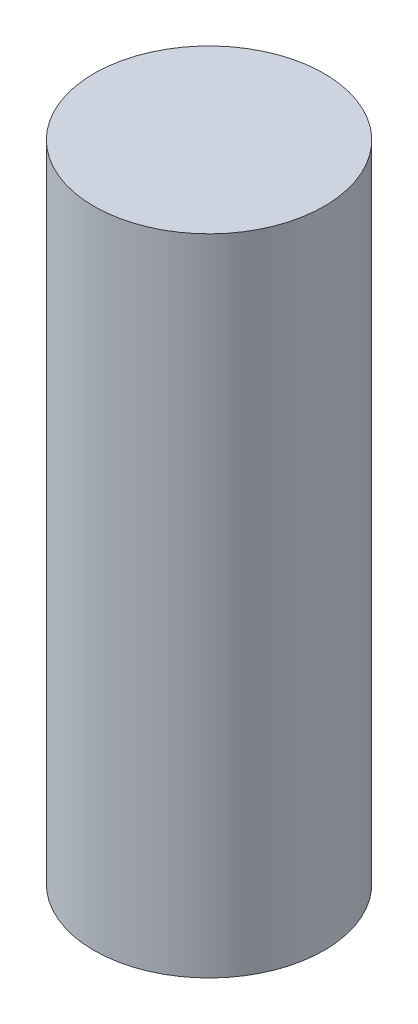
ISO-10303-21;
HEADER;
FILE_DESCRIPTION(('STEP AP214'),'2;1');
FILE_NAME('part.step','',(''),(''),'','','');
FILE_SCHEMA(('AUTOMOTIVE_DESIGN { 1 0 10303 214 1 1 1 1 }'));
ENDSEC;
DATA;
#1=APPLICATION_CONTEXT('core data for automotive mechanical design processes');
#2=APPLICATION_PROTOCOL_DEFINITION('international standard','automotive_design',2000,#1);
#3=PRODUCT_CONTEXT('',#1,'mechanical');
#4=PRODUCT('Part','Part','',(#3));
#5=PRODUCT_RELATED_PRODUCT_CATEGORY('part','',(#4));
#6=PRODUCT_DEFINITION_FORMATION('','',#4);
#7=PRODUCT_DEFINITION_CONTEXT('part definition',#1,'design');
#8=PRODUCT_DEFINITION('design','',#6,#7);
#9=PRODUCT_DEFINITION_SHAPE('','',#8);
#10=(LENGTH_UNIT() NAMED_UNIT(*) SI_UNIT(.MILLI.,.METRE.));
#11=(NAMED_UNIT(*) PLANE_ANGLE_UNIT() SI_UNIT($,.RADIAN.));
#12=(NAMED_UNIT(*) SI_UNIT($,.STERADIAN.) SOLID_ANGLE_UNIT());
#13=UNCERTAINTY_MEASURE_WITH_UNIT(LENGTH_MEASURE(1.E-05),#10,'distance_accuracy_value','');
#14=(GEOMETRIC_REPRESENTATION_CONTEXT(3) GLOBAL_UNCERTAINTY_ASSIGNED_CONTEXT((#13)) GLOBAL_UNIT_ASSIGNED_CONTEXT((#10,
#11,#12)) REPRESENTATION_CONTEXT('',''));
#15=CARTESIAN_POINT('',(0.,0.,0.));
#16=DIRECTION('',(0.,0.,1.));
#17=DIRECTION('',(1.,0.,0.));
#18=AXIS2_PLACEMENT_3D('',#15,#16,#17);
#19=CARTESIAN_POINT('',(0.,177.8,0.));
#20=DIRECTION('',(0.,-1.,0.));
#21=DIRECTION('',(0.,0.,-1.));
#22=AXIS2_PLACEMENT_3D('',#19,#20,#21);
#23=CYLINDRICAL_SURFACE('',#22,31.75);
#24=CARTESIAN_POINT('',(0.,177.8,0.));
#25=DIRECTION('',(0.,1.,0.));
#26=DIRECTION('',(0.,0.,1.));
#27=AXIS2_PLACEMENT_3D('',#24,#25,#26);
#28=CIRCLE('',#27,31.75);
#29=CARTESIAN_POINT('',(0.,177.8,31.75));
#30=VERTEX_POINT('',#29);
#31=EDGE_CURVE('E10',#30,#30,#28,.T.);
#32=ORIENTED_EDGE('',*,*,#31,.F.);
#33=EDGE_LOOP('',(#32));
#34=FACE_BOUND('',#33,.T.);
#35=CARTESIAN_POINT('',(0.,0.,0.));
#36=DIRECTION('',(0.,1.,0.));
#37=DIRECTION('',(0.,0.,1.));
#38=AXIS2_PLACEMENT_3D('',#35,#36,#37);
#39=CIRCLE('',#38,31.75);
#40=CARTESIAN_POINT('',(0.,0.,31.75));
#41=VERTEX_POINT('',#40);
#42=EDGE_CURVE('E44',#41,#41,#39,.T.);
#43=ORIENTED_EDGE('',*,*,#42,.T.);
#44=EDGE_LOOP('',(#43));
#45=FACE_BOUND('',#44,.T.);
#46=ADVANCED_FACE('F41',(#34,#45),#23,.T.);
#47=CARTESIAN_POINT('',(0.,177.8,0.));
#48=DIRECTION('',(0.,1.,0.));
#49=DIRECTION('',(0.,0.,1.));
#50=AXIS2_PLACEMENT_3D('',#47,#48,#49);
#51=PLANE('',#50);
#52=ORIENTED_EDGE('',*,*,#31,.T.);
#53=EDGE_LOOP('',(#52));
#54=FACE_BOUND('',#53,.T.);
#55=ADVANCED_FACE('F56',(#54),#51,.T.);
#56=CARTESIAN_POINT('',(0.,0.,0.));
#57=DIRECTION('',(0.,1.,0.));
#58=DIRECTION('',(0.,0.,1.));
#59=AXIS2_PLACEMENT_3D('',#56,#57,#58);
#60=PLANE('',#59);
#61=ORIENTED_EDGE('',*,*,#42,.F.);
#62=EDGE_LOOP('',(#61));
#63=FACE_BOUND('',#62,.T.);
#64=ADVANCED_FACE('F54',(#63),#60,.F.);
#65=CLOSED_SHELL('',(#46,#55,#64));
#66=MANIFOLD_SOLID_BREP('B2',#65);
#67=ADVANCED_BREP_SHAPE_REPRESENTATION('',(#18,#66),#14);
#68=SHAPE_DEFINITION_REPRESENTATION(#9,#67);
ENDSEC;
END-ISO-10303-21;
